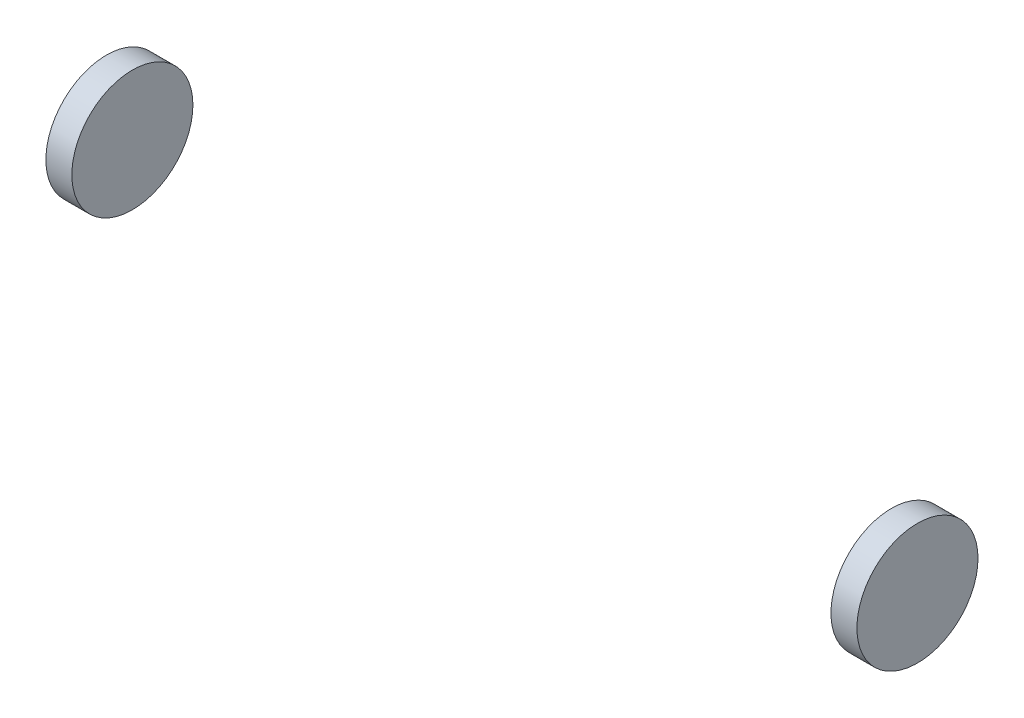
ISO-10303-21;
HEADER;
FILE_DESCRIPTION(('STEP AP214'),'2;1');
FILE_NAME('part.step','',(''),(''),'','','');
FILE_SCHEMA(('AUTOMOTIVE_DESIGN { 1 0 10303 214 1 1 1 1 }'));
ENDSEC;
DATA;
#1=APPLICATION_CONTEXT('core data for automotive mechanical design processes');
#2=APPLICATION_PROTOCOL_DEFINITION('international standard','automotive_design',2000,#1);
#3=PRODUCT_CONTEXT('',#1,'mechanical');
#4=PRODUCT('Part','Part','',(#3));
#5=PRODUCT_RELATED_PRODUCT_CATEGORY('part','',(#4));
#6=PRODUCT_DEFINITION_FORMATION('','',#4);
#7=PRODUCT_DEFINITION_CONTEXT('part definition',#1,'design');
#8=PRODUCT_DEFINITION('design','',#6,#7);
#9=PRODUCT_DEFINITION_SHAPE('','',#8);
#10=(LENGTH_UNIT() NAMED_UNIT(*) SI_UNIT(.MILLI.,.METRE.));
#11=(NAMED_UNIT(*) PLANE_ANGLE_UNIT() SI_UNIT($,.RADIAN.));
#12=(NAMED_UNIT(*) SI_UNIT($,.STERADIAN.) SOLID_ANGLE_UNIT());
#13=UNCERTAINTY_MEASURE_WITH_UNIT(LENGTH_MEASURE(1.E-05),#10,'distance_accuracy_value','');
#14=(GEOMETRIC_REPRESENTATION_CONTEXT(3) GLOBAL_UNCERTAINTY_ASSIGNED_CONTEXT((#13)) GLOBAL_UNIT_ASSIGNED_CONTEXT((#10,
#11,#12)) REPRESENTATION_CONTEXT('',''));
#15=CARTESIAN_POINT('',(0.,0.,0.));
#16=DIRECTION('',(0.,0.,1.));
#17=DIRECTION('',(1.,0.,0.));
#18=AXIS2_PLACEMENT_3D('',#15,#16,#17);
#19=CARTESIAN_POINT('',(937.712701273992,0.,0.));
#20=DIRECTION('',(-1.,0.,0.));
#21=DIRECTION('',(0.,0.,1.));
#22=AXIS2_PLACEMENT_3D('',#19,#20,#21);
#23=CYLINDRICAL_SURFACE('',#22,140.);
#24=CARTESIAN_POINT('',(937.712701273992,0.,0.));
#25=DIRECTION('',(1.,0.,0.));
#26=DIRECTION('',(0.,0.,-1.));
#27=AXIS2_PLACEMENT_3D('',#24,#25,#26);
#28=CIRCLE('',#27,140.);
#29=CARTESIAN_POINT('',(937.712701273992,0.,-140.));
#30=VERTEX_POINT('',#29);
#31=EDGE_CURVE('E11',#30,#30,#28,.T.);
#32=ORIENTED_EDGE('',*,*,#31,.F.);
#33=EDGE_LOOP('',(#32));
#34=FACE_BOUND('',#33,.T.);
#35=CARTESIAN_POINT('',(877.712701273992,0.,0.));
#36=DIRECTION('',(1.,0.,0.));
#37=DIRECTION('',(0.,0.,-1.));
#38=AXIS2_PLACEMENT_3D('',#35,#36,#37);
#39=CIRCLE('',#38,140.);
#40=CARTESIAN_POINT('',(877.712701273992,0.,-140.));
#41=VERTEX_POINT('',#40);
#42=EDGE_CURVE('E48',#41,#41,#39,.T.);
#43=ORIENTED_EDGE('',*,*,#42,.T.);
#44=EDGE_LOOP('',(#43));
#45=FACE_BOUND('',#44,.T.);
#46=ADVANCED_FACE('F44',(#34,#45),#23,.T.);
#47=CARTESIAN_POINT('',(937.712701273992,0.,0.));
#48=DIRECTION('',(1.,0.,0.));
#49=DIRECTION('',(0.,0.,-1.));
#50=AXIS2_PLACEMENT_3D('',#47,#48,#49);
#51=PLANE('',#50);
#52=ORIENTED_EDGE('',*,*,#31,.T.);
#53=EDGE_LOOP('',(#52));
#54=FACE_BOUND('',#53,.T.);
#55=ADVANCED_FACE('F58',(#54),#51,.T.);
#56=CARTESIAN_POINT('',(877.712701273992,0.,0.));
#57=DIRECTION('',(1.,0.,0.));
#58=DIRECTION('',(0.,0.,-1.));
#59=AXIS2_PLACEMENT_3D('',#56,#57,#58);
#60=PLANE('',#59);
#61=ORIENTED_EDGE('',*,*,#42,.F.);
#62=EDGE_LOOP('',(#61));
#63=FACE_BOUND('',#62,.T.);
#64=ADVANCED_FACE('F59',(#63),#60,.F.);
#65=CLOSED_SHELL('',(#46,#55,#64));
#66=MANIFOLD_SOLID_BREP('B2',#65);
#67=CARTESIAN_POINT('',(-877.712701273992,0.,0.));
#68=DIRECTION('',(-1.,0.,0.));
#69=DIRECTION('',(0.,0.,1.));
#70=AXIS2_PLACEMENT_3D('',#67,#68,#69);
#71=CYLINDRICAL_SURFACE('',#70,140.);
#72=CARTESIAN_POINT('',(-877.712701273992,0.,0.));
#73=DIRECTION('',(1.,0.,0.));
#74=DIRECTION('',(0.,0.,-1.));
#75=AXIS2_PLACEMENT_3D('',#72,#73,#74);
#76=CIRCLE('',#75,140.);
#77=CARTESIAN_POINT('',(-877.712701273992,0.,-140.));
#78=VERTEX_POINT('',#77);
#79=EDGE_CURVE('E42',#78,#78,#76,.T.);
#80=ORIENTED_EDGE('',*,*,#79,.F.);
#81=EDGE_LOOP('',(#80));
#82=FACE_BOUND('',#81,.T.);
#83=CARTESIAN_POINT('',(-937.712701273992,0.,0.));
#84=DIRECTION('',(1.,0.,0.));
#85=DIRECTION('',(0.,0.,-1.));
#86=AXIS2_PLACEMENT_3D('',#83,#84,#85);
#87=CIRCLE('',#86,140.);
#88=CARTESIAN_POINT('',(-937.712701273992,0.,-140.));
#89=VERTEX_POINT('',#88);
#90=EDGE_CURVE('E90',#89,#89,#87,.T.);
#91=ORIENTED_EDGE('',*,*,#90,.T.);
#92=EDGE_LOOP('',(#91));
#93=FACE_BOUND('',#92,.T.);
#94=ADVANCED_FACE('F88',(#82,#93),#71,.T.);
#95=CARTESIAN_POINT('',(-877.712701273992,0.,0.));
#96=DIRECTION('',(1.,0.,0.));
#97=DIRECTION('',(0.,0.,-1.));
#98=AXIS2_PLACEMENT_3D('',#95,#96,#97);
#99=PLANE('',#98);
#100=ORIENTED_EDGE('',*,*,#79,.T.);
#101=EDGE_LOOP('',(#100));
#102=FACE_BOUND('',#101,.T.);
#103=ADVANCED_FACE('F101',(#102),#99,.T.);
#104=CARTESIAN_POINT('',(-937.712701273992,0.,0.));
#105=DIRECTION('',(1.,0.,0.));
#106=DIRECTION('',(0.,0.,-1.));
#107=AXIS2_PLACEMENT_3D('',#104,#105,#106);
#108=PLANE('',#107);
#109=ORIENTED_EDGE('',*,*,#90,.F.);
#110=EDGE_LOOP('',(#109));
#111=FACE_BOUND('',#110,.T.);
#112=ADVANCED_FACE('F97',(#111),#108,.F.);
#113=CLOSED_SHELL('',(#94,#103,#112));
#114=MANIFOLD_SOLID_BREP('B6',#113);
#115=ADVANCED_BREP_SHAPE_REPRESENTATION('',(#18,#66,#114),#14);
#116=SHAPE_DEFINITION_REPRESENTATION(#9,#115);
ENDSEC;
END-ISO-10303-21;
